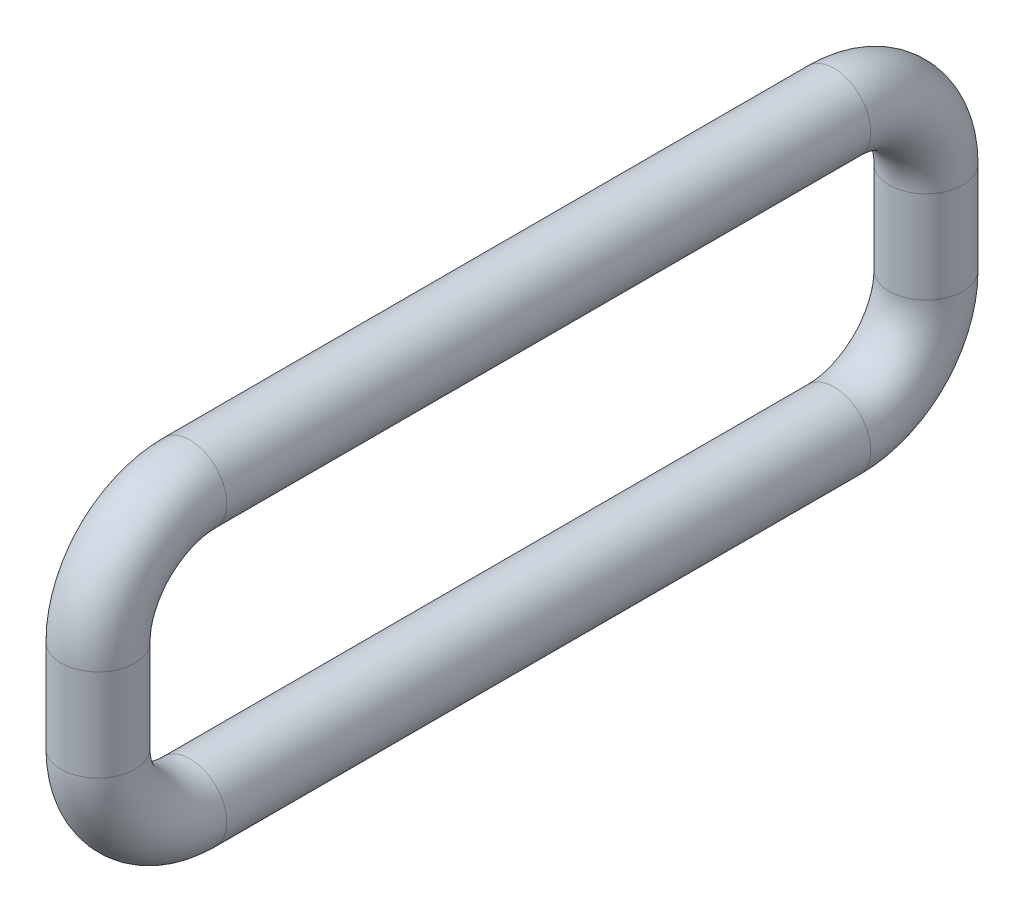
ISO-10303-21;
HEADER;
FILE_DESCRIPTION(('STEP AP214'),'2;1');
FILE_NAME('part.step','',(''),(''),'','','');
FILE_SCHEMA(('AUTOMOTIVE_DESIGN { 1 0 10303 214 1 1 1 1 }'));
ENDSEC;
DATA;
#1=APPLICATION_CONTEXT('core data for automotive mechanical design processes');
#2=APPLICATION_PROTOCOL_DEFINITION('international standard','automotive_design',2000,#1);
#3=PRODUCT_CONTEXT('',#1,'mechanical');
#4=PRODUCT('Part','Part','',(#3));
#5=PRODUCT_RELATED_PRODUCT_CATEGORY('part','',(#4));
#6=PRODUCT_DEFINITION_FORMATION('','',#4);
#7=PRODUCT_DEFINITION_CONTEXT('part definition',#1,'design');
#8=PRODUCT_DEFINITION('design','',#6,#7);
#9=PRODUCT_DEFINITION_SHAPE('','',#8);
#10=(LENGTH_UNIT() NAMED_UNIT(*) SI_UNIT(.MILLI.,.METRE.));
#11=(NAMED_UNIT(*) PLANE_ANGLE_UNIT() SI_UNIT($,.RADIAN.));
#12=(NAMED_UNIT(*) SI_UNIT($,.STERADIAN.) SOLID_ANGLE_UNIT());
#13=UNCERTAINTY_MEASURE_WITH_UNIT(LENGTH_MEASURE(1.E-05),#10,'distance_accuracy_value','');
#14=(GEOMETRIC_REPRESENTATION_CONTEXT(3) GLOBAL_UNCERTAINTY_ASSIGNED_CONTEXT((#13)) GLOBAL_UNIT_ASSIGNED_CONTEXT((#10,
#11,#12)) REPRESENTATION_CONTEXT('',''));
#15=CARTESIAN_POINT('',(0.,0.,0.));
#16=DIRECTION('',(0.,0.,1.));
#17=DIRECTION('',(1.,0.,0.));
#18=AXIS2_PLACEMENT_3D('',#15,#16,#17);
#19=CARTESIAN_POINT('',(0.,14.9999999999932,2.92771759216867E-12));
#20=DIRECTION('',(0.,0.,-1.));
#21=DIRECTION('',(0.,1.,0.));
#22=AXIS2_PLACEMENT_3D('',#19,#20,#21);
#23=CYLINDRICAL_SURFACE('',#22,4.);
#24=CARTESIAN_POINT('',(0.,15.,-35.));
#25=DIRECTION('',(0.,1.95181172811334E-13,-1.));
#26=DIRECTION('',(1.,0.,0.));
#27=AXIS2_PLACEMENT_3D('',#24,#25,#26);
#28=CIRCLE('',#27,4.);
#29=CARTESIAN_POINT('',(0.,19.,-35.0000000000001));
#30=VERTEX_POINT('',#29);
#31=EDGE_CURVE('E47',#30,#30,#28,.T.);
#32=ORIENTED_EDGE('',*,*,#31,.F.);
#33=EDGE_LOOP('',(#32));
#34=FACE_BOUND('',#33,.T.);
#35=CARTESIAN_POINT('',(0.,14.9999999999863,35.0000000000059));
#36=DIRECTION('',(0.,1.95181172811334E-13,-1.));
#37=DIRECTION('',(1.,0.,0.));
#38=AXIS2_PLACEMENT_3D('',#35,#36,#37);
#39=CIRCLE('',#38,4.);
#40=CARTESIAN_POINT('',(0.,18.9999999999864,35.0000000000075));
#41=VERTEX_POINT('',#40);
#42=EDGE_CURVE('E61',#41,#41,#39,.T.);
#43=ORIENTED_EDGE('',*,*,#42,.T.);
#44=EDGE_LOOP('',(#43));
#45=FACE_BOUND('',#44,.T.);
#46=ADVANCED_FACE('F32',(#34,#45),#23,.T.);
#47=CARTESIAN_POINT('',(0.,5.00000000000001,-35.));
#48=DIRECTION('',(-1.,0.,0.));
#49=DIRECTION('',(0.,0.,1.));
#50=AXIS2_PLACEMENT_3D('',#47,#48,#49);
#51=TOROIDAL_SURFACE('',#50,10.,4.);
#52=CARTESIAN_POINT('',(0.,4.99999999999996,-45.));
#53=DIRECTION('',(0.,-1.,-1.95317472513018E-13));
#54=DIRECTION('',(1.,0.,0.));
#55=AXIS2_PLACEMENT_3D('',#52,#53,#54);
#56=CIRCLE('',#55,4.);
#57=CARTESIAN_POINT('',(0.,4.99999999999994,-49.));
#58=VERTEX_POINT('',#57);
#59=EDGE_CURVE('E43',#58,#58,#56,.T.);
#60=CARTESIAN_POINT('',(0.,5.00000000000001,-35.));
#61=DIRECTION('',(-1.,0.,0.));
#62=DIRECTION('',(0.,0.,1.));
#63=AXIS2_PLACEMENT_3D('',#60,#61,#62);
#64=CIRCLE('',#63,14.);
#65=EDGE_CURVE('',#30,#58,#64,.T.);
#66=ORIENTED_EDGE('',*,*,#31,.T.);
#67=ORIENTED_EDGE('',*,*,#59,.F.);
#68=ORIENTED_EDGE('',*,*,#65,.T.);
#69=ORIENTED_EDGE('',*,*,#65,.F.);
#70=EDGE_LOOP('',(#66,#68,#67,#69));
#71=FACE_BOUND('',#70,.T.);
#72=ADVANCED_FACE('F80',(#71),#51,.T.);
#73=CARTESIAN_POINT('',(0.,4.99999999999996,-45.));
#74=DIRECTION('',(0.,-1.,0.));
#75=DIRECTION('',(0.,0.,-1.));
#76=AXIS2_PLACEMENT_3D('',#73,#74,#75);
#77=CYLINDRICAL_SURFACE('',#76,4.);
#78=CARTESIAN_POINT('',(0.,-5.00000000000007,-45.));
#79=DIRECTION('',(0.,-1.,-1.95230736339219E-13));
#80=DIRECTION('',(1.,0.,0.));
#81=AXIS2_PLACEMENT_3D('',#78,#79,#80);
#82=CIRCLE('',#81,4.);
#83=CARTESIAN_POINT('',(0.,-5.00000000000009,-49.));
#84=VERTEX_POINT('',#83);
#85=EDGE_CURVE('E39',#84,#84,#82,.T.);
#86=ORIENTED_EDGE('',*,*,#85,.F.);
#87=EDGE_LOOP('',(#86));
#88=FACE_BOUND('',#87,.T.);
#89=ORIENTED_EDGE('',*,*,#59,.T.);
#90=EDGE_LOOP('',(#89));
#91=FACE_BOUND('',#90,.T.);
#92=ADVANCED_FACE('F86',(#88,#91),#77,.T.);
#93=CARTESIAN_POINT('',(0.,-5.00000000000001,-35.));
#94=DIRECTION('',(-1.,0.,0.));
#95=DIRECTION('',(0.,0.,1.));
#96=AXIS2_PLACEMENT_3D('',#93,#94,#95);
#97=TOROIDAL_SURFACE('',#96,10.,4.);
#98=CARTESIAN_POINT('',(0.,-15.,-34.999999999997));
#99=DIRECTION('',(0.,0.,1.));
#100=DIRECTION('',(1.,0.,0.));
#101=AXIS2_PLACEMENT_3D('',#98,#99,#100);
#102=CIRCLE('',#101,4.);
#103=CARTESIAN_POINT('',(0.,-19.,-34.9999999999958));
#104=VERTEX_POINT('',#103);
#105=EDGE_CURVE('E10',#104,#104,#102,.T.);
#106=CARTESIAN_POINT('',(0.,-5.00000000000001,-35.));
#107=DIRECTION('',(-1.,0.,0.));
#108=DIRECTION('',(0.,0.,1.));
#109=AXIS2_PLACEMENT_3D('',#106,#107,#108);
#110=CIRCLE('',#109,14.);
#111=EDGE_CURVE('',#84,#104,#110,.T.);
#112=ORIENTED_EDGE('',*,*,#85,.T.);
#113=ORIENTED_EDGE('',*,*,#105,.F.);
#114=ORIENTED_EDGE('',*,*,#111,.T.);
#115=ORIENTED_EDGE('',*,*,#111,.F.);
#116=EDGE_LOOP('',(#112,#114,#113,#115));
#117=FACE_BOUND('',#116,.T.);
#118=ADVANCED_FACE('F78',(#117),#97,.T.);
#119=CARTESIAN_POINT('',(0.,-15.,-35.));
#120=DIRECTION('',(0.,1.95230736339219E-13,1.));
#121=DIRECTION('',(0.,-1.,1.95230736339219E-13));
#122=AXIS2_PLACEMENT_3D('',#119,#120,#121);
#123=CYLINDRICAL_SURFACE('',#122,4.);
#124=ORIENTED_EDGE('',*,*,#105,.T.);
#125=EDGE_LOOP('',(#124));
#126=FACE_BOUND('',#125,.T.);
#127=CARTESIAN_POINT('',(0.,-15.0000000000137,34.9999999999912));
#128=DIRECTION('',(0.,-3.90362345622667E-13,1.));
#129=DIRECTION('',(1.,0.,0.));
#130=AXIS2_PLACEMENT_3D('',#127,#128,#129);
#131=CIRCLE('',#130,4.);
#132=CARTESIAN_POINT('',(0.,-19.0000000000137,34.9999999999884));
#133=VERTEX_POINT('',#132);
#134=EDGE_CURVE('E52',#133,#133,#131,.T.);
#135=ORIENTED_EDGE('',*,*,#134,.F.);
#136=EDGE_LOOP('',(#135));
#137=FACE_BOUND('',#136,.T.);
#138=ADVANCED_FACE('F34',(#126,#137),#123,.T.);
#139=CARTESIAN_POINT('',(0.,4.99999999998635,35.0000000000019));
#140=DIRECTION('',(-1.,0.,0.));
#141=DIRECTION('',(0.,3.90362345622667E-13,-1.));
#142=AXIS2_PLACEMENT_3D('',#139,#140,#141);
#143=TOROIDAL_SURFACE('',#142,10.,4.);
#144=CARTESIAN_POINT('',(0.,4.9999999999824,45.0000000000019));
#145=DIRECTION('',(0.,1.,1.9504487310965E-13));
#146=DIRECTION('',(1.,0.,0.));
#147=AXIS2_PLACEMENT_3D('',#144,#145,#146);
#148=CIRCLE('',#147,4.);
#149=CARTESIAN_POINT('',(0.,4.99999999998081,49.0000000000019));
#150=VERTEX_POINT('',#149);
#151=EDGE_CURVE('E58',#150,#150,#148,.T.);
#152=CARTESIAN_POINT('',(0.,4.99999999998635,35.0000000000019));
#153=DIRECTION('',(-1.,0.,0.));
#154=DIRECTION('',(0.,3.90362345622667E-13,-1.));
#155=AXIS2_PLACEMENT_3D('',#152,#153,#154);
#156=CIRCLE('',#155,14.);
#157=EDGE_CURVE('',#150,#41,#156,.T.);
#158=ORIENTED_EDGE('',*,*,#151,.T.);
#159=ORIENTED_EDGE('',*,*,#42,.F.);
#160=ORIENTED_EDGE('',*,*,#157,.T.);
#161=ORIENTED_EDGE('',*,*,#157,.F.);
#162=EDGE_LOOP('',(#158,#160,#159,#161));
#163=FACE_BOUND('',#162,.T.);
#164=ADVANCED_FACE('F66',(#163),#143,.T.);
#165=CARTESIAN_POINT('',(0.,4.99999999998239,45.0000000000019));
#166=DIRECTION('',(0.,-1.,-3.90362345622667E-13));
#167=DIRECTION('',(0.,-3.90362345622667E-13,1.));
#168=AXIS2_PLACEMENT_3D('',#165,#166,#167);
#169=CYLINDRICAL_SURFACE('',#168,4.);
#170=CARTESIAN_POINT('',(0.,-5.00000000001763,44.999999999998));
#171=DIRECTION('',(0.,1.,1.95131609283449E-13));
#172=DIRECTION('',(1.,0.,0.));
#173=AXIS2_PLACEMENT_3D('',#170,#171,#172);
#174=CIRCLE('',#173,4.);
#175=CARTESIAN_POINT('',(0.,-5.00000000001922,48.999999999998));
#176=VERTEX_POINT('',#175);
#177=EDGE_CURVE('E55',#176,#176,#174,.T.);
#178=ORIENTED_EDGE('',*,*,#177,.T.);
#179=EDGE_LOOP('',(#178));
#180=FACE_BOUND('',#179,.T.);
#181=ORIENTED_EDGE('',*,*,#151,.F.);
#182=EDGE_LOOP('',(#181));
#183=FACE_BOUND('',#182,.T.);
#184=ADVANCED_FACE('F68',(#180,#183),#169,.T.);
#185=CARTESIAN_POINT('',(0.,-5.00000000001368,34.999999999998));
#186=DIRECTION('',(-1.,0.,0.));
#187=DIRECTION('',(0.,3.90362345622667E-13,-1.));
#188=AXIS2_PLACEMENT_3D('',#185,#186,#187);
#189=TOROIDAL_SURFACE('',#188,10.,4.);
#190=CARTESIAN_POINT('',(0.,-5.00000000001368,34.999999999998));
#191=DIRECTION('',(-1.,0.,0.));
#192=DIRECTION('',(0.,3.90362345622667E-13,-1.));
#193=AXIS2_PLACEMENT_3D('',#190,#191,#192);
#194=CIRCLE('',#193,14.);
#195=EDGE_CURVE('',#133,#176,#194,.T.);
#196=ORIENTED_EDGE('',*,*,#134,.T.);
#197=ORIENTED_EDGE('',*,*,#177,.F.);
#198=ORIENTED_EDGE('',*,*,#195,.T.);
#199=ORIENTED_EDGE('',*,*,#195,.F.);
#200=EDGE_LOOP('',(#196,#198,#197,#199));
#201=FACE_BOUND('',#200,.T.);
#202=ADVANCED_FACE('F75',(#201),#189,.T.);
#203=CLOSED_SHELL('',(#46,#72,#92,#118,#138,#164,#184,#202));
#204=MANIFOLD_SOLID_BREP('B2',#203);
#205=ADVANCED_BREP_SHAPE_REPRESENTATION('',(#18,#204),#14);
#206=SHAPE_DEFINITION_REPRESENTATION(#9,#205);
ENDSEC;
END-ISO-10303-21;
